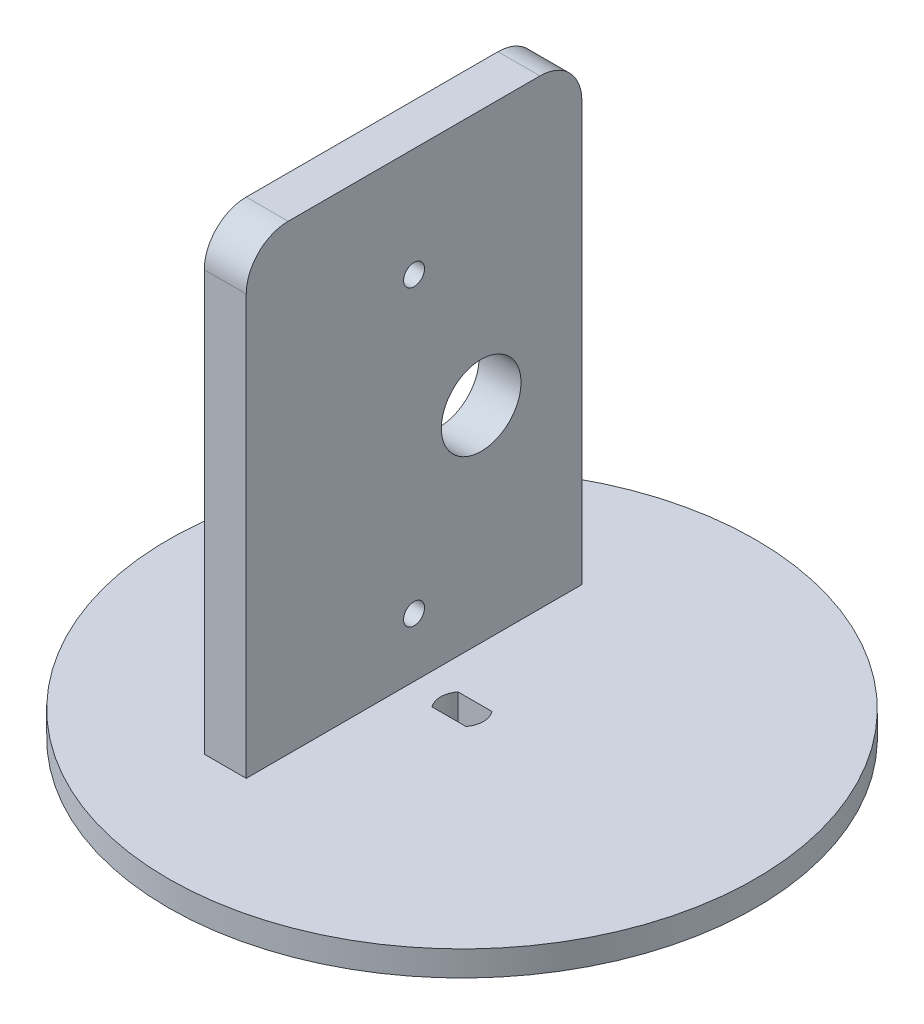
ISO-10303-21;
HEADER;
FILE_DESCRIPTION(('STEP AP214'),'2;1');
FILE_NAME('part.step','',(''),(''),'','','');
FILE_SCHEMA(('AUTOMOTIVE_DESIGN { 1 0 10303 214 1 1 1 1 }'));
ENDSEC;
DATA;
#1=APPLICATION_CONTEXT('core data for automotive mechanical design processes');
#2=APPLICATION_PROTOCOL_DEFINITION('international standard','automotive_design',2000,#1);
#3=PRODUCT_CONTEXT('',#1,'mechanical');
#4=PRODUCT('Part','Part','',(#3));
#5=PRODUCT_RELATED_PRODUCT_CATEGORY('part','',(#4));
#6=PRODUCT_DEFINITION_FORMATION('','',#4);
#7=PRODUCT_DEFINITION_CONTEXT('part definition',#1,'design');
#8=PRODUCT_DEFINITION('design','',#6,#7);
#9=PRODUCT_DEFINITION_SHAPE('','',#8);
#10=(LENGTH_UNIT() NAMED_UNIT(*) SI_UNIT(.MILLI.,.METRE.));
#11=(NAMED_UNIT(*) PLANE_ANGLE_UNIT() SI_UNIT($,.RADIAN.));
#12=(NAMED_UNIT(*) SI_UNIT($,.STERADIAN.) SOLID_ANGLE_UNIT());
#13=UNCERTAINTY_MEASURE_WITH_UNIT(LENGTH_MEASURE(1.E-05),#10,'distance_accuracy_value','');
#14=(GEOMETRIC_REPRESENTATION_CONTEXT(3) GLOBAL_UNCERTAINTY_ASSIGNED_CONTEXT((#13)) GLOBAL_UNIT_ASSIGNED_CONTEXT((#10,
#11,#12)) REPRESENTATION_CONTEXT('',''));
#15=CARTESIAN_POINT('',(0.,0.,0.));
#16=DIRECTION('',(0.,0.,1.));
#17=DIRECTION('',(1.,0.,0.));
#18=AXIS2_PLACEMENT_3D('',#15,#16,#17);
#19=CARTESIAN_POINT('',(0.,0.,0.));
#20=DIRECTION('',(0.,1.,0.));
#21=DIRECTION('',(0.,0.,1.));
#22=AXIS2_PLACEMENT_3D('',#19,#20,#21);
#23=PLANE('',#22);
#24=CARTESIAN_POINT('',(0.,0.,0.));
#25=DIRECTION('',(0.,1.,0.));
#26=DIRECTION('',(0.,0.,1.));
#27=AXIS2_PLACEMENT_3D('',#24,#25,#26);
#28=CIRCLE('',#27,35.);
#29=CARTESIAN_POINT('',(0.,0.,35.));
#30=VERTEX_POINT('',#29);
#31=EDGE_CURVE('E181',#30,#30,#28,.T.);
#32=ORIENTED_EDGE('',*,*,#31,.F.);
#33=EDGE_LOOP('',(#32));
#34=FACE_BOUND('',#33,.T.);
#35=CARTESIAN_POINT('',(0.,0.,0.));
#36=DIRECTION('',(0.,1.,0.));
#37=DIRECTION('',(0.,0.,1.));
#38=AXIS2_PLACEMENT_3D('',#35,#36,#37);
#39=CIRCLE('',#38,7.5);
#40=CARTESIAN_POINT('',(0.,0.,7.5));
#41=VERTEX_POINT('',#40);
#42=EDGE_CURVE('E185',#41,#41,#39,.F.);
#43=ORIENTED_EDGE('',*,*,#42,.F.);
#44=EDGE_LOOP('',(#43));
#45=FACE_BOUND('',#44,.T.);
#46=ADVANCED_FACE('F33',(#34,#45),#23,.F.);
#47=CARTESIAN_POINT('',(0.,3.,0.));
#48=DIRECTION('',(0.,1.,0.));
#49=DIRECTION('',(0.,0.,1.));
#50=AXIS2_PLACEMENT_3D('',#47,#48,#49);
#51=PLANE('',#50);
#52=DIRECTION('',(0.,0.,-1.));
#53=VECTOR('',#52,1.);
#54=CARTESIAN_POINT('',(-5.7150480190524,3.,-20.));
#55=LINE('',#54,#53);
#56=CARTESIAN_POINT('',(-5.7150480190524,3.,20.));
#57=VERTEX_POINT('',#56);
#58=CARTESIAN_POINT('',(-5.7150480190524,3.,-20.));
#59=VERTEX_POINT('',#58);
#60=EDGE_CURVE('E132',#57,#59,#55,.T.);
#61=ORIENTED_EDGE('',*,*,#60,.F.);
#62=DIRECTION('',(1.,0.,0.));
#63=VECTOR('',#62,1.);
#64=CARTESIAN_POINT('',(-5.7150480190524,3.,20.));
#65=LINE('',#64,#63);
#66=CARTESIAN_POINT('',(-10.7150480190524,3.,20.));
#67=VERTEX_POINT('',#66);
#68=EDGE_CURVE('E129',#67,#57,#65,.T.);
#69=ORIENTED_EDGE('',*,*,#68,.F.);
#70=DIRECTION('',(0.,0.,1.));
#71=VECTOR('',#70,1.);
#72=CARTESIAN_POINT('',(-10.7150480190524,3.,-20.));
#73=LINE('',#72,#71);
#74=CARTESIAN_POINT('',(-10.7150480190524,3.,-20.));
#75=VERTEX_POINT('',#74);
#76=EDGE_CURVE('E114',#75,#67,#73,.T.);
#77=ORIENTED_EDGE('',*,*,#76,.F.);
#78=DIRECTION('',(-1.,0.,0.));
#79=VECTOR('',#78,1.);
#80=CARTESIAN_POINT('',(-5.7150480190524,3.,-20.));
#81=LINE('',#80,#79);
#82=EDGE_CURVE('E126',#59,#75,#81,.T.);
#83=ORIENTED_EDGE('',*,*,#82,.F.);
#84=EDGE_LOOP('',(#61,#69,#77,#83));
#85=FACE_BOUND('',#84,.T.);
#86=CARTESIAN_POINT('',(0.,3.,0.));
#87=DIRECTION('',(0.,1.,0.));
#88=DIRECTION('',(0.,0.,1.));
#89=AXIS2_PLACEMENT_3D('',#86,#87,#88);
#90=CIRCLE('',#89,35.);
#91=CARTESIAN_POINT('',(0.,3.,35.));
#92=VERTEX_POINT('',#91);
#93=EDGE_CURVE('E182',#92,#92,#90,.T.);
#94=ORIENTED_EDGE('',*,*,#93,.T.);
#95=EDGE_LOOP('',(#94));
#96=FACE_BOUND('',#95,.T.);
#97=DIRECTION('',(1.,0.,0.));
#98=VECTOR('',#97,1.);
#99=CARTESIAN_POINT('',(-2.02484567313166,3.,1.55));
#100=LINE('',#99,#98);
#101=CARTESIAN_POINT('',(-2.02484567313166,3.,1.55));
#102=VERTEX_POINT('',#101);
#103=CARTESIAN_POINT('',(2.02484567313166,3.,1.55));
#104=VERTEX_POINT('',#103);
#105=EDGE_CURVE('E166',#102,#104,#100,.T.);
#106=ORIENTED_EDGE('',*,*,#105,.F.);
#107=CARTESIAN_POINT('',(0.,3.,0.));
#108=DIRECTION('',(0.,1.,0.));
#109=DIRECTION('',(0.,0.,1.));
#110=AXIS2_PLACEMENT_3D('',#107,#108,#109);
#111=CIRCLE('',#110,2.55);
#112=CARTESIAN_POINT('',(-2.02484567313166,3.,-1.55));
#113=VERTEX_POINT('',#112);
#114=EDGE_CURVE('E164',#113,#102,#111,.T.);
#115=ORIENTED_EDGE('',*,*,#114,.F.);
#116=DIRECTION('',(-1.,0.,0.));
#117=VECTOR('',#116,1.);
#118=CARTESIAN_POINT('',(-2.02484567313166,3.,-1.55));
#119=LINE('',#118,#117);
#120=CARTESIAN_POINT('',(2.02484567313166,3.,-1.55));
#121=VERTEX_POINT('',#120);
#122=EDGE_CURVE('E171',#121,#113,#119,.T.);
#123=ORIENTED_EDGE('',*,*,#122,.F.);
#124=CARTESIAN_POINT('',(0.,3.,0.));
#125=DIRECTION('',(0.,1.,0.));
#126=DIRECTION('',(0.,0.,1.));
#127=AXIS2_PLACEMENT_3D('',#124,#125,#126);
#128=CIRCLE('',#127,2.55);
#129=EDGE_CURVE('E168',#104,#121,#128,.T.);
#130=ORIENTED_EDGE('',*,*,#129,.F.);
#131=EDGE_LOOP('',(#106,#115,#123,#130));
#132=FACE_BOUND('',#131,.T.);
#133=ADVANCED_FACE('F124',(#85,#96,#132),#51,.T.);
#134=CARTESIAN_POINT('',(0.,3.,0.));
#135=DIRECTION('',(0.,-1.,0.));
#136=DIRECTION('',(0.,0.,-1.));
#137=AXIS2_PLACEMENT_3D('',#134,#135,#136);
#138=CYLINDRICAL_SURFACE('',#137,35.);
#139=ORIENTED_EDGE('',*,*,#93,.F.);
#140=EDGE_LOOP('',(#139));
#141=FACE_BOUND('',#140,.T.);
#142=ORIENTED_EDGE('',*,*,#31,.T.);
#143=EDGE_LOOP('',(#142));
#144=FACE_BOUND('',#143,.T.);
#145=ADVANCED_FACE('F229',(#141,#144),#138,.T.);
#146=CARTESIAN_POINT('',(0.,3.,0.));
#147=DIRECTION('',(0.,-1.,0.));
#148=DIRECTION('',(0.,0.,-1.));
#149=AXIS2_PLACEMENT_3D('',#146,#147,#148);
#150=CYLINDRICAL_SURFACE('',#149,2.55);
#151=DIRECTION('',(0.,-1.,0.));
#152=VECTOR('',#151,1.);
#153=CARTESIAN_POINT('',(-2.02484567313166,3.,1.55));
#154=LINE('',#153,#152);
#155=CARTESIAN_POINT('',(-2.02484567313166,-6.,1.55));
#156=VERTEX_POINT('',#155);
#157=EDGE_CURVE('E179',#102,#156,#154,.T.);
#158=ORIENTED_EDGE('',*,*,#157,.T.);
#159=CARTESIAN_POINT('',(0.,-6.,0.));
#160=DIRECTION('',(0.,-1.,0.));
#161=DIRECTION('',(0.,0.,-1.));
#162=AXIS2_PLACEMENT_3D('',#159,#160,#161);
#163=CIRCLE('',#162,2.55);
#164=CARTESIAN_POINT('',(-2.02484567313166,-6.,-1.55));
#165=VERTEX_POINT('',#164);
#166=EDGE_CURVE('E149',#156,#165,#163,.T.);
#167=ORIENTED_EDGE('',*,*,#166,.T.);
#168=DIRECTION('',(0.,-1.,0.));
#169=VECTOR('',#168,1.);
#170=CARTESIAN_POINT('',(-2.02484567313166,3.,-1.55));
#171=LINE('',#170,#169);
#172=EDGE_CURVE('E173',#113,#165,#171,.T.);
#173=ORIENTED_EDGE('',*,*,#172,.F.);
#174=ORIENTED_EDGE('',*,*,#114,.T.);
#175=EDGE_LOOP('',(#158,#167,#173,#174));
#176=FACE_BOUND('',#175,.T.);
#177=ADVANCED_FACE('F236',(#176),#150,.F.);
#178=CARTESIAN_POINT('',(-2.02484567313166,3.,1.55));
#179=DIRECTION('',(0.,0.,-1.));
#180=DIRECTION('',(-1.,0.,0.));
#181=AXIS2_PLACEMENT_3D('',#178,#179,#180);
#182=PLANE('',#181);
#183=CARTESIAN_POINT('',(0.,-3.,1.55));
#184=DIRECTION('',(0.,0.,-1.));
#185=DIRECTION('',(-1.,0.,0.));
#186=AXIS2_PLACEMENT_3D('',#183,#184,#185);
#187=CIRCLE('',#186,1.25);
#188=CARTESIAN_POINT('',(-1.25,-3.,1.55));
#189=VERTEX_POINT('',#188);
#190=EDGE_CURVE('E145',#189,#189,#187,.T.);
#191=ORIENTED_EDGE('',*,*,#190,.F.);
#192=EDGE_LOOP('',(#191));
#193=FACE_BOUND('',#192,.T.);
#194=DIRECTION('',(0.,-1.,0.));
#195=VECTOR('',#194,1.);
#196=CARTESIAN_POINT('',(2.02484567313166,3.,1.55));
#197=LINE('',#196,#195);
#198=CARTESIAN_POINT('',(2.02484567313166,-6.,1.55));
#199=VERTEX_POINT('',#198);
#200=EDGE_CURVE('E177',#104,#199,#197,.T.);
#201=ORIENTED_EDGE('',*,*,#200,.T.);
#202=DIRECTION('',(-1.,0.,0.));
#203=VECTOR('',#202,1.);
#204=CARTESIAN_POINT('',(-2.02484567313166,-6.,1.55));
#205=LINE('',#204,#203);
#206=EDGE_CURVE('E158',#199,#156,#205,.T.);
#207=ORIENTED_EDGE('',*,*,#206,.T.);
#208=ORIENTED_EDGE('',*,*,#157,.F.);
#209=ORIENTED_EDGE('',*,*,#105,.T.);
#210=EDGE_LOOP('',(#201,#207,#208,#209));
#211=FACE_BOUND('',#210,.T.);
#212=ADVANCED_FACE('F337',(#193,#211),#182,.T.);
#213=CARTESIAN_POINT('',(0.,3.,0.));
#214=DIRECTION('',(0.,-1.,0.));
#215=DIRECTION('',(0.,0.,-1.));
#216=AXIS2_PLACEMENT_3D('',#213,#214,#215);
#217=CYLINDRICAL_SURFACE('',#216,2.55);
#218=DIRECTION('',(0.,-1.,0.));
#219=VECTOR('',#218,1.);
#220=CARTESIAN_POINT('',(2.02484567313166,3.,-1.55));
#221=LINE('',#220,#219);
#222=CARTESIAN_POINT('',(2.02484567313166,-6.,-1.55));
#223=VERTEX_POINT('',#222);
#224=EDGE_CURVE('E175',#121,#223,#221,.T.);
#225=ORIENTED_EDGE('',*,*,#224,.T.);
#226=CARTESIAN_POINT('',(0.,-6.,0.));
#227=DIRECTION('',(0.,-1.,0.));
#228=DIRECTION('',(0.,0.,-1.));
#229=AXIS2_PLACEMENT_3D('',#226,#227,#228);
#230=CIRCLE('',#229,2.55);
#231=EDGE_CURVE('E155',#223,#199,#230,.T.);
#232=ORIENTED_EDGE('',*,*,#231,.T.);
#233=ORIENTED_EDGE('',*,*,#200,.F.);
#234=ORIENTED_EDGE('',*,*,#129,.T.);
#235=EDGE_LOOP('',(#225,#232,#233,#234));
#236=FACE_BOUND('',#235,.T.);
#237=ADVANCED_FACE('F219',(#236),#217,.F.);
#238=CARTESIAN_POINT('',(-2.02484567313166,3.,-1.55));
#239=DIRECTION('',(0.,0.,1.));
#240=DIRECTION('',(1.,0.,0.));
#241=AXIS2_PLACEMENT_3D('',#238,#239,#240);
#242=PLANE('',#241);
#243=ORIENTED_EDGE('',*,*,#172,.T.);
#244=DIRECTION('',(1.,0.,0.));
#245=VECTOR('',#244,1.);
#246=CARTESIAN_POINT('',(-2.02484567313166,-6.,-1.55));
#247=LINE('',#246,#245);
#248=EDGE_CURVE('E152',#165,#223,#247,.T.);
#249=ORIENTED_EDGE('',*,*,#248,.T.);
#250=ORIENTED_EDGE('',*,*,#224,.F.);
#251=ORIENTED_EDGE('',*,*,#122,.T.);
#252=EDGE_LOOP('',(#243,#249,#250,#251));
#253=FACE_BOUND('',#252,.T.);
#254=ADVANCED_FACE('F212',(#253),#242,.T.);
#255=CARTESIAN_POINT('',(0.,-6.,0.));
#256=DIRECTION('',(0.,-1.,0.));
#257=DIRECTION('',(0.,0.,-1.));
#258=AXIS2_PLACEMENT_3D('',#255,#256,#257);
#259=PLANE('',#258);
#260=CARTESIAN_POINT('',(0.,-6.,0.));
#261=DIRECTION('',(0.,-1.,0.));
#262=DIRECTION('',(0.,0.,-1.));
#263=AXIS2_PLACEMENT_3D('',#260,#261,#262);
#264=CIRCLE('',#263,7.5);
#265=CARTESIAN_POINT('',(0.,-6.,-7.5));
#266=VERTEX_POINT('',#265);
#267=EDGE_CURVE('E161',#266,#266,#264,.T.);
#268=ORIENTED_EDGE('',*,*,#267,.T.);
#269=EDGE_LOOP('',(#268));
#270=FACE_BOUND('',#269,.T.);
#271=ORIENTED_EDGE('',*,*,#248,.F.);
#272=ORIENTED_EDGE('',*,*,#166,.F.);
#273=ORIENTED_EDGE('',*,*,#206,.F.);
#274=ORIENTED_EDGE('',*,*,#231,.F.);
#275=EDGE_LOOP('',(#271,#272,#273,#274));
#276=FACE_BOUND('',#275,.T.);
#277=ADVANCED_FACE('F210',(#270,#276),#259,.T.);
#278=CARTESIAN_POINT('',(0.,-6.,0.));
#279=DIRECTION('',(0.,1.,0.));
#280=DIRECTION('',(0.,0.,1.));
#281=AXIS2_PLACEMENT_3D('',#278,#279,#280);
#282=CYLINDRICAL_SURFACE('',#281,7.5);
#283=CARTESIAN_POINT('',(0.,-4.25,7.5));
#284=CARTESIAN_POINT('',(-0.0696954524791074,-4.24999720552609,7.49999880584412));
#285=CARTESIAN_POINT('',(-0.13942894091941,-4.24415136251554,7.49901838956517));
#286=CARTESIAN_POINT('',(-0.276940110836521,-4.22093217061734,7.49520172470694));
#287=CARTESIAN_POINT('',(-0.344715933979624,-4.2035482215442,7.49236376961945));
#288=CARTESIAN_POINT('',(-0.476302373606322,-4.15779227570362,7.48515034118225));
#289=CARTESIAN_POINT('',(-0.54011618421595,-4.12942926717971,7.48077612579596));
#290=CARTESIAN_POINT('',(-0.662070920988972,-4.0625438539738,7.47097113541035));
#291=CARTESIAN_POINT('',(-0.720212494939296,-4.0240226112585,7.46554048127217));
#292=CARTESIAN_POINT('',(-0.82973630714584,-3.93752245808977,7.45416658729156));
#293=CARTESIAN_POINT('',(-0.881056451767484,-3.88946544268194,7.44821935907428));
#294=CARTESIAN_POINT('',(-0.974944249329964,-3.78542601576359,7.43651313438366));
#295=CARTESIAN_POINT('',(-1.01751134969549,-3.72944310427169,7.43075414981334));
#296=CARTESIAN_POINT('',(-1.09293356280257,-3.61071451690147,7.4200378287989));
#297=CARTESIAN_POINT('',(-1.1257272764305,-3.54792933159762,7.41508564545818));
#298=CARTESIAN_POINT('',(-1.18027918270561,-3.41764521784969,7.40659894897337));
#299=CARTESIAN_POINT('',(-1.20203812078281,-3.35014660816118,7.40306434007154));
#300=CARTESIAN_POINT('',(-1.2337071888924,-3.21300986257173,7.39785268421378));
#301=CARTESIAN_POINT('',(-1.2437245145677,-3.1433971317493,7.3961588424285));
#302=CARTESIAN_POINT('',(-1.25195836264494,-3.00345986155826,7.39476969468325));
#303=CARTESIAN_POINT('',(-1.2501757201945,-2.93313537291635,7.39507424728607));
#304=CARTESIAN_POINT('',(-1.23494754919808,-2.79453606936228,7.39763214431778));
#305=CARTESIAN_POINT('',(-1.22162244094489,-2.72624759822738,7.39986536659458));
#306=CARTESIAN_POINT('',(-1.18387657020172,-2.59288934108543,7.40599747605504));
#307=CARTESIAN_POINT('',(-1.15945542715987,-2.52781966555573,7.40989642036636));
#308=CARTESIAN_POINT('',(-1.10008862304696,-2.40238558827954,7.4189423966705));
#309=CARTESIAN_POINT('',(-1.06509295693986,-2.34204529695939,7.42409533553663));
#310=CARTESIAN_POINT('',(-0.985606008778717,-2.22804779973081,7.43506459207504));
#311=CARTESIAN_POINT('',(-0.941113960327144,-2.17439113377253,7.44088096327143));
#312=CARTESIAN_POINT('',(-0.843241106079527,-2.07458695709633,7.45261013939893));
#313=CARTESIAN_POINT('',(-0.789756981936563,-2.02854074072996,7.45852324615826));
#314=CARTESIAN_POINT('',(-0.675767624490823,-1.94606111866733,7.46971300698362));
#315=CARTESIAN_POINT('',(-0.615262345953211,-1.90962777490839,7.47498965694873));
#316=CARTESIAN_POINT('',(-0.488852958083356,-1.84739888643186,7.48431946446456));
#317=CARTESIAN_POINT('',(-0.422944362782331,-1.82161229033437,7.48837159203724));
#318=CARTESIAN_POINT('',(-0.287649172801366,-1.78150289237701,7.4947875150633));
#319=CARTESIAN_POINT('',(-0.218262869589734,-1.76717913151314,7.49715145175237));
#320=CARTESIAN_POINT('',(-0.0788549506508121,-1.75053932076943,7.49990564921343));
#321=CARTESIAN_POINT('',(-0.00885036857550596,-1.7480842140972,7.50031876506392));
#322=CARTESIAN_POINT('',(0.130569886444943,-1.75488067221406,7.49918737210585));
#323=CARTESIAN_POINT('',(0.199985581946019,-1.76413178656687,7.49764293862059));
#324=CARTESIAN_POINT('',(0.335828087773382,-1.79396242466774,7.49278413469101));
#325=CARTESIAN_POINT('',(0.402270434192689,-1.81447310419506,7.48948052400655));
#326=CARTESIAN_POINT('',(0.530773442430221,-1.86616725909977,7.48147232227679));
#327=CARTESIAN_POINT('',(0.592833857954859,-1.89735133381764,7.4767676525601));
#328=CARTESIAN_POINT('',(0.711415344734479,-1.96982556234839,7.46642258151204));
#329=CARTESIAN_POINT('',(0.767882625468574,-2.01120257808363,7.46077427943511));
#330=CARTESIAN_POINT('',(0.873121792751344,-2.10276865769253,7.4491923369595));
#331=CARTESIAN_POINT('',(0.921893119848291,-2.15295836163833,7.44325867585773));
#332=CARTESIAN_POINT('',(1.010871389829,-2.26134877403571,7.43170087617923));
#333=CARTESIAN_POINT('',(1.05098438055686,-2.31962708275721,7.42608058068553));
#334=CARTESIAN_POINT('',(1.12085115514749,-2.44217648456927,7.41585764888942));
#335=CARTESIAN_POINT('',(1.15060526738491,-2.50644738761375,7.4112549803301));
#336=CARTESIAN_POINT('',(1.19876916573657,-2.63889486640607,7.40361726848852));
#337=CARTESIAN_POINT('',(1.21722571627397,-2.70705404751524,7.40057577155532));
#338=CARTESIAN_POINT('',(1.24241772688914,-2.84556006461088,7.3963885841763));
#339=CARTESIAN_POINT('',(1.24915420597308,-2.91590670986603,7.39524272891361));
#340=CARTESIAN_POINT('',(1.25068643302368,-3.0558525829812,7.39498366542006));
#341=CARTESIAN_POINT('',(1.24563006806259,-3.12545018928764,7.39584528252825));
#342=CARTESIAN_POINT('',(1.22403991947842,-3.26278962402538,7.39944890726864));
#343=CARTESIAN_POINT('',(1.20750617305624,-3.33053145847094,7.40219090880607));
#344=CARTESIAN_POINT('',(1.16348724479745,-3.46217921864631,7.40923678140859));
#345=CARTESIAN_POINT('',(1.13601479530022,-3.52608950502801,7.41353883609835));
#346=CARTESIAN_POINT('',(1.07091350195795,-3.64841783459742,7.42322184461104));
#347=CARTESIAN_POINT('',(1.03328415437428,-3.70683560518607,7.428602851942));
#348=CARTESIAN_POINT('',(0.948409442186078,-3.81726779155388,7.43991727022811));
#349=CARTESIAN_POINT('',(0.901055281796824,-3.86919800835014,7.44585647788151));
#350=CARTESIAN_POINT('',(0.798304515690115,-3.96442580223747,7.4575718618042));
#351=CARTESIAN_POINT('',(0.742906056456318,-4.00772138431909,7.46334800013273));
#352=CARTESIAN_POINT('',(0.62518458482014,-4.08472413409997,7.4741326482111));
#353=CARTESIAN_POINT('',(0.562816393766409,-4.11836301965648,7.47913558126552));
#354=CARTESIAN_POINT('',(0.43325653468949,-4.17463474230496,7.48775583800888));
#355=CARTESIAN_POINT('',(0.366069747415005,-4.19727854053985,7.49137454088741));
#356=CARTESIAN_POINT('',(0.2488516550227,-4.22600263706333,7.49602895416478));
#357=CARTESIAN_POINT('',(0.199529415149223,-4.23498723480798,7.49751013636679));
#358=CARTESIAN_POINT('',(0.100144655159904,-4.24698686892238,7.4994960799306));
#359=CARTESIAN_POINT('',(0.0500821478042469,-4.25000200806868,7.50000085810321));
#360=CARTESIAN_POINT('',(0.,-4.25,7.5));
#361=B_SPLINE_CURVE_WITH_KNOTS('',3,(#283,#284,#285,#286,#287,#288,#289,#290,#291,#292,#293,
#294,#295,#296,#297,#298,#299,#300,#301,#302,#303,#304,#305,#306,#307,#308,#309,#310,#311,#312,
#313,#314,#315,#316,#317,#318,#319,#320,#321,#322,#323,#324,#325,#326,#327,#328,#329,#330,#331,
#332,#333,#334,#335,#336,#337,#338,#339,#340,#341,#342,#343,#344,#345,#346,#347,#348,#349,#350,
#351,#352,#353,#354,#355,#356,#357,#358,#359,#360),.UNSPECIFIED.,.T.,.F.,(4,2,2,2,2,2,2,2,2,2,2,
2,2,2,2,2,2,2,2,2,2,2,2,2,2,2,2,2,2,2,2,2,2,2,2,2,2,2,4),(0.,0.208903292469255,0.41799877284771,
0.626923433512635,0.835824206337395,1.04651245531166,1.25721400084928,1.4692126041192,
1.68119688438091,1.89123038551712,2.10124902160443,2.30910260880204,2.51696332512691,
2.72582278316279,2.93469910340287,3.14616384955663,3.35762995817924,3.56927344457952,
3.78089922260574,3.99003941745699,4.1991715651793,4.40703903503208,4.61491817913033,
4.82463412813512,5.03436531527142,5.2462691100381,5.45816618687972,5.66918011170886,
5.88017568893309,6.0885395476135,6.29690273094066,6.50502409113111,6.71315577514668,
6.92375692096696,7.13440666939486,7.346511158036,7.55840376065036,7.70852124082009,
7.85863613638484),.UNSPECIFIED.);
#362=CARTESIAN_POINT('',(0.,-4.25,7.5));
#363=VERTEX_POINT('',#362);
#364=EDGE_CURVE('E148',#363,#363,#361,.T.);
#365=ORIENTED_EDGE('',*,*,#364,.T.);
#366=EDGE_LOOP('',(#365));
#367=FACE_BOUND('',#366,.T.);
#368=ORIENTED_EDGE('',*,*,#267,.F.);
#369=EDGE_LOOP('',(#368));
#370=FACE_BOUND('',#369,.T.);
#371=ORIENTED_EDGE('',*,*,#42,.T.);
#372=EDGE_LOOP('',(#371));
#373=FACE_BOUND('',#372,.T.);
#374=ADVANCED_FACE('F199',(#367,#370,#373),#282,.T.);
#375=CARTESIAN_POINT('',(0.,-3.,7.55));
#376=DIRECTION('',(0.,0.,-1.));
#377=DIRECTION('',(-1.,0.,0.));
#378=AXIS2_PLACEMENT_3D('',#375,#376,#377);
#379=CYLINDRICAL_SURFACE('',#378,1.25);
#380=ORIENTED_EDGE('',*,*,#190,.T.);
#381=EDGE_LOOP('',(#380));
#382=FACE_BOUND('',#381,.T.);
#383=ORIENTED_EDGE('',*,*,#364,.F.);
#384=EDGE_LOOP('',(#383));
#385=FACE_BOUND('',#384,.T.);
#386=ADVANCED_FACE('F203',(#382,#385),#379,.F.);
#387=CARTESIAN_POINT('',(-5.7150480190524,58.,-20.));
#388=DIRECTION('',(-1.,0.,0.));
#389=DIRECTION('',(0.,0.,1.));
#390=AXIS2_PLACEMENT_3D('',#387,#388,#389);
#391=PLANE('',#390);
#392=CARTESIAN_POINT('',(-5.7150480190524,45.,0.));
#393=DIRECTION('',(-1.,0.,0.));
#394=DIRECTION('',(0.,0.,1.));
#395=AXIS2_PLACEMENT_3D('',#392,#393,#394);
#396=CIRCLE('',#395,1.25);
#397=CARTESIAN_POINT('',(-5.7150480190524,45.,1.25));
#398=VERTEX_POINT('',#397);
#399=EDGE_CURVE('E134',#398,#398,#396,.F.);
#400=ORIENTED_EDGE('',*,*,#399,.F.);
#401=EDGE_LOOP('',(#400));
#402=FACE_BOUND('',#401,.T.);
#403=CARTESIAN_POINT('',(-5.7150480190524,10.,0.));
#404=DIRECTION('',(-1.,0.,0.));
#405=DIRECTION('',(0.,0.,1.));
#406=AXIS2_PLACEMENT_3D('',#403,#404,#405);
#407=CIRCLE('',#406,1.25);
#408=CARTESIAN_POINT('',(-5.7150480190524,10.,1.25));
#409=VERTEX_POINT('',#408);
#410=EDGE_CURVE('E275',#409,#409,#407,.F.);
#411=ORIENTED_EDGE('',*,*,#410,.F.);
#412=EDGE_LOOP('',(#411));
#413=FACE_BOUND('',#412,.T.);
#414=CARTESIAN_POINT('',(-5.7150480190524,27.5,-8.));
#415=DIRECTION('',(-1.,0.,0.));
#416=DIRECTION('',(0.,0.,1.));
#417=AXIS2_PLACEMENT_3D('',#414,#415,#416);
#418=CIRCLE('',#417,4.75);
#419=CARTESIAN_POINT('',(-5.7150480190524,27.5,-3.25));
#420=VERTEX_POINT('',#419);
#421=EDGE_CURVE('E268',#420,#420,#418,.F.);
#422=ORIENTED_EDGE('',*,*,#421,.F.);
#423=EDGE_LOOP('',(#422));
#424=FACE_BOUND('',#423,.T.);
#425=DIRECTION('',(0.,-1.,0.));
#426=VECTOR('',#425,1.);
#427=CARTESIAN_POINT('',(-5.7150480190524,58.,-20.));
#428=LINE('',#427,#426);
#429=CARTESIAN_POINT('',(-5.7150480190524,53.,-20.));
#430=VERTEX_POINT('',#429);
#431=EDGE_CURVE('E117',#430,#59,#428,.T.);
#432=ORIENTED_EDGE('',*,*,#431,.F.);
#433=CARTESIAN_POINT('',(-5.7150480190524,53.,-15.));
#434=DIRECTION('',(-1.,0.,0.));
#435=DIRECTION('',(0.,0.,1.));
#436=AXIS2_PLACEMENT_3D('',#433,#434,#435);
#437=CIRCLE('',#436,5.);
#438=CARTESIAN_POINT('',(-5.7150480190524,58.,-15.));
#439=VERTEX_POINT('',#438);
#440=EDGE_CURVE('E41',#430,#439,#437,.F.);
#441=ORIENTED_EDGE('',*,*,#440,.T.);
#442=DIRECTION('',(0.,0.,-1.));
#443=VECTOR('',#442,1.);
#444=CARTESIAN_POINT('',(-5.7150480190524,58.,-20.));
#445=LINE('',#444,#443);
#446=CARTESIAN_POINT('',(-5.7150480190524,58.,15.));
#447=VERTEX_POINT('',#446);
#448=EDGE_CURVE('E139',#447,#439,#445,.T.);
#449=ORIENTED_EDGE('',*,*,#448,.F.);
#450=CARTESIAN_POINT('',(-5.7150480190524,53.,15.));
#451=DIRECTION('',(-1.,0.,0.));
#452=DIRECTION('',(0.,0.,1.));
#453=AXIS2_PLACEMENT_3D('',#450,#451,#452);
#454=CIRCLE('',#453,5.);
#455=CARTESIAN_POINT('',(-5.7150480190524,53.,20.));
#456=VERTEX_POINT('',#455);
#457=EDGE_CURVE('E48',#447,#456,#454,.F.);
#458=ORIENTED_EDGE('',*,*,#457,.T.);
#459=DIRECTION('',(0.,-1.,0.));
#460=VECTOR('',#459,1.);
#461=CARTESIAN_POINT('',(-5.7150480190524,58.,20.));
#462=LINE('',#461,#460);
#463=EDGE_CURVE('E140',#456,#57,#462,.T.);
#464=ORIENTED_EDGE('',*,*,#463,.T.);
#465=ORIENTED_EDGE('',*,*,#60,.T.);
#466=EDGE_LOOP('',(#432,#441,#449,#458,#464,#465));
#467=FACE_BOUND('',#466,.T.);
#468=ADVANCED_FACE('F207',(#402,#413,#424,#467),#391,.F.);
#469=CARTESIAN_POINT('',(-5.7150480190524,58.,-20.));
#470=DIRECTION('',(0.,0.,1.));
#471=DIRECTION('',(1.,0.,0.));
#472=AXIS2_PLACEMENT_3D('',#469,#470,#471);
#473=PLANE('',#472);
#474=DIRECTION('',(0.,-1.,0.));
#475=VECTOR('',#474,1.);
#476=CARTESIAN_POINT('',(-10.7150480190524,58.,-20.));
#477=LINE('',#476,#475);
#478=CARTESIAN_POINT('',(-10.7150480190524,53.,-20.));
#479=VERTEX_POINT('',#478);
#480=EDGE_CURVE('E109',#479,#75,#477,.T.);
#481=ORIENTED_EDGE('',*,*,#480,.F.);
#482=DIRECTION('',(-1.,0.,0.));
#483=VECTOR('',#482,1.);
#484=CARTESIAN_POINT('',(-5.7150480190524,53.,-20.));
#485=LINE('',#484,#483);
#486=EDGE_CURVE('E56',#479,#430,#485,.F.);
#487=ORIENTED_EDGE('',*,*,#486,.T.);
#488=ORIENTED_EDGE('',*,*,#431,.T.);
#489=ORIENTED_EDGE('',*,*,#82,.T.);
#490=EDGE_LOOP('',(#481,#487,#488,#489));
#491=FACE_BOUND('',#490,.T.);
#492=ADVANCED_FACE('F131',(#491),#473,.F.);
#493=CARTESIAN_POINT('',(-10.7150480190524,58.,-20.));
#494=DIRECTION('',(1.,0.,0.));
#495=DIRECTION('',(0.,0.,-1.));
#496=AXIS2_PLACEMENT_3D('',#493,#494,#495);
#497=PLANE('',#496);
#498=CARTESIAN_POINT('',(-10.7150480190524,45.,0.));
#499=DIRECTION('',(-1.,0.,0.));
#500=DIRECTION('',(0.,0.,1.));
#501=AXIS2_PLACEMENT_3D('',#498,#499,#500);
#502=CIRCLE('',#501,1.25);
#503=CARTESIAN_POINT('',(-10.7150480190524,45.,1.25));
#504=VERTEX_POINT('',#503);
#505=EDGE_CURVE('E278',#504,#504,#502,.T.);
#506=ORIENTED_EDGE('',*,*,#505,.F.);
#507=EDGE_LOOP('',(#506));
#508=FACE_BOUND('',#507,.T.);
#509=CARTESIAN_POINT('',(-10.7150480190524,10.,0.));
#510=DIRECTION('',(-1.,0.,0.));
#511=DIRECTION('',(0.,0.,1.));
#512=AXIS2_PLACEMENT_3D('',#509,#510,#511);
#513=CIRCLE('',#512,1.25);
#514=CARTESIAN_POINT('',(-10.7150480190524,10.,1.25));
#515=VERTEX_POINT('',#514);
#516=EDGE_CURVE('E271',#515,#515,#513,.T.);
#517=ORIENTED_EDGE('',*,*,#516,.F.);
#518=EDGE_LOOP('',(#517));
#519=FACE_BOUND('',#518,.T.);
#520=CARTESIAN_POINT('',(-10.7150480190524,27.5,-8.));
#521=DIRECTION('',(-1.,0.,0.));
#522=DIRECTION('',(0.,0.,1.));
#523=AXIS2_PLACEMENT_3D('',#520,#521,#522);
#524=CIRCLE('',#523,4.75);
#525=CARTESIAN_POINT('',(-10.7150480190524,27.5,-3.25));
#526=VERTEX_POINT('',#525);
#527=EDGE_CURVE('E272',#526,#526,#524,.T.);
#528=ORIENTED_EDGE('',*,*,#527,.F.);
#529=EDGE_LOOP('',(#528));
#530=FACE_BOUND('',#529,.T.);
#531=DIRECTION('',(0.,0.,1.));
#532=VECTOR('',#531,1.);
#533=CARTESIAN_POINT('',(-10.7150480190524,58.,-20.));
#534=LINE('',#533,#532);
#535=CARTESIAN_POINT('',(-10.7150480190524,58.,-15.));
#536=VERTEX_POINT('',#535);
#537=CARTESIAN_POINT('',(-10.7150480190524,58.,15.));
#538=VERTEX_POINT('',#537);
#539=EDGE_CURVE('E142',#536,#538,#534,.T.);
#540=ORIENTED_EDGE('',*,*,#539,.F.);
#541=CARTESIAN_POINT('',(-10.7150480190524,53.,-15.));
#542=DIRECTION('',(1.,0.,0.));
#543=DIRECTION('',(0.,0.,-1.));
#544=AXIS2_PLACEMENT_3D('',#541,#542,#543);
#545=CIRCLE('',#544,5.);
#546=EDGE_CURVE('E115',#536,#479,#545,.F.);
#547=ORIENTED_EDGE('',*,*,#546,.T.);
#548=ORIENTED_EDGE('',*,*,#480,.T.);
#549=ORIENTED_EDGE('',*,*,#76,.T.);
#550=DIRECTION('',(0.,-1.,0.));
#551=VECTOR('',#550,1.);
#552=CARTESIAN_POINT('',(-10.7150480190524,58.,20.));
#553=LINE('',#552,#551);
#554=CARTESIAN_POINT('',(-10.7150480190524,53.,20.));
#555=VERTEX_POINT('',#554);
#556=EDGE_CURVE('E118',#555,#67,#553,.T.);
#557=ORIENTED_EDGE('',*,*,#556,.F.);
#558=CARTESIAN_POINT('',(-10.7150480190524,53.,15.));
#559=DIRECTION('',(1.,0.,0.));
#560=DIRECTION('',(0.,0.,-1.));
#561=AXIS2_PLACEMENT_3D('',#558,#559,#560);
#562=CIRCLE('',#561,5.);
#563=EDGE_CURVE('E259',#555,#538,#562,.F.);
#564=ORIENTED_EDGE('',*,*,#563,.T.);
#565=EDGE_LOOP('',(#540,#547,#548,#549,#557,#564));
#566=FACE_BOUND('',#565,.T.);
#567=ADVANCED_FACE('F112',(#508,#519,#530,#566),#497,.F.);
#568=CARTESIAN_POINT('',(-5.7150480190524,58.,20.));
#569=DIRECTION('',(0.,0.,-1.));
#570=DIRECTION('',(-1.,0.,0.));
#571=AXIS2_PLACEMENT_3D('',#568,#569,#570);
#572=PLANE('',#571);
#573=ORIENTED_EDGE('',*,*,#463,.F.);
#574=DIRECTION('',(1.,0.,0.));
#575=VECTOR('',#574,1.);
#576=CARTESIAN_POINT('',(-5.7150480190524,53.,20.));
#577=LINE('',#576,#575);
#578=EDGE_CURVE('E11',#456,#555,#577,.F.);
#579=ORIENTED_EDGE('',*,*,#578,.T.);
#580=ORIENTED_EDGE('',*,*,#556,.T.);
#581=ORIENTED_EDGE('',*,*,#68,.T.);
#582=EDGE_LOOP('',(#573,#579,#580,#581));
#583=FACE_BOUND('',#582,.T.);
#584=ADVANCED_FACE('F289',(#583),#572,.F.);
#585=CARTESIAN_POINT('',(0.,58.,0.));
#586=DIRECTION('',(0.,-1.,0.));
#587=DIRECTION('',(0.,0.,-1.));
#588=AXIS2_PLACEMENT_3D('',#585,#586,#587);
#589=PLANE('',#588);
#590=ORIENTED_EDGE('',*,*,#448,.T.);
#591=DIRECTION('',(-1.,0.,0.));
#592=VECTOR('',#591,1.);
#593=CARTESIAN_POINT('',(0.,58.,-15.));
#594=LINE('',#593,#592);
#595=EDGE_CURVE('E253',#439,#536,#594,.T.);
#596=ORIENTED_EDGE('',*,*,#595,.T.);
#597=ORIENTED_EDGE('',*,*,#539,.T.);
#598=DIRECTION('',(1.,0.,0.));
#599=VECTOR('',#598,1.);
#600=CARTESIAN_POINT('',(0.,58.,15.));
#601=LINE('',#600,#599);
#602=EDGE_CURVE('E190',#538,#447,#601,.T.);
#603=ORIENTED_EDGE('',*,*,#602,.T.);
#604=EDGE_LOOP('',(#590,#596,#597,#603));
#605=FACE_BOUND('',#604,.T.);
#606=ADVANCED_FACE('F264',(#605),#589,.F.);
#607=CARTESIAN_POINT('',(7.719980823492,27.5,-8.));
#608=DIRECTION('',(-1.,0.,0.));
#609=DIRECTION('',(0.,0.,1.));
#610=AXIS2_PLACEMENT_3D('',#607,#608,#609);
#611=CYLINDRICAL_SURFACE('',#610,4.75);
#612=ORIENTED_EDGE('',*,*,#421,.T.);
#613=EDGE_LOOP('',(#612));
#614=FACE_BOUND('',#613,.T.);
#615=ORIENTED_EDGE('',*,*,#527,.T.);
#616=EDGE_LOOP('',(#615));
#617=FACE_BOUND('',#616,.T.);
#618=ADVANCED_FACE('F295',(#614,#617),#611,.F.);
#619=CARTESIAN_POINT('',(7.719980823492,10.,0.));
#620=DIRECTION('',(-1.,0.,0.));
#621=DIRECTION('',(0.,0.,1.));
#622=AXIS2_PLACEMENT_3D('',#619,#620,#621);
#623=CYLINDRICAL_SURFACE('',#622,1.25);
#624=ORIENTED_EDGE('',*,*,#410,.T.);
#625=EDGE_LOOP('',(#624));
#626=FACE_BOUND('',#625,.T.);
#627=ORIENTED_EDGE('',*,*,#516,.T.);
#628=EDGE_LOOP('',(#627));
#629=FACE_BOUND('',#628,.T.);
#630=ADVANCED_FACE('F247',(#626,#629),#623,.F.);
#631=CARTESIAN_POINT('',(7.719980823492,45.,0.));
#632=DIRECTION('',(-1.,0.,0.));
#633=DIRECTION('',(0.,0.,1.));
#634=AXIS2_PLACEMENT_3D('',#631,#632,#633);
#635=CYLINDRICAL_SURFACE('',#634,1.25);
#636=ORIENTED_EDGE('',*,*,#399,.T.);
#637=EDGE_LOOP('',(#636));
#638=FACE_BOUND('',#637,.T.);
#639=ORIENTED_EDGE('',*,*,#505,.T.);
#640=EDGE_LOOP('',(#639));
#641=FACE_BOUND('',#640,.T.);
#642=ADVANCED_FACE('F240',(#638,#641),#635,.F.);
#643=CARTESIAN_POINT('',(0.,53.,-15.));
#644=DIRECTION('',(-1.,0.,0.));
#645=DIRECTION('',(0.,0.,1.));
#646=AXIS2_PLACEMENT_3D('',#643,#644,#645);
#647=CYLINDRICAL_SURFACE('',#646,5.);
#648=ORIENTED_EDGE('',*,*,#440,.F.);
#649=ORIENTED_EDGE('',*,*,#486,.F.);
#650=ORIENTED_EDGE('',*,*,#546,.F.);
#651=ORIENTED_EDGE('',*,*,#595,.F.);
#652=EDGE_LOOP('',(#648,#649,#650,#651));
#653=FACE_BOUND('',#652,.T.);
#654=ADVANCED_FACE('F238',(#653),#647,.T.);
#655=CARTESIAN_POINT('',(0.,53.,15.));
#656=DIRECTION('',(1.,0.,0.));
#657=DIRECTION('',(0.,0.,-1.));
#658=AXIS2_PLACEMENT_3D('',#655,#656,#657);
#659=CYLINDRICAL_SURFACE('',#658,5.);
#660=ORIENTED_EDGE('',*,*,#563,.F.);
#661=ORIENTED_EDGE('',*,*,#578,.F.);
#662=ORIENTED_EDGE('',*,*,#457,.F.);
#663=ORIENTED_EDGE('',*,*,#602,.F.);
#664=EDGE_LOOP('',(#660,#661,#662,#663));
#665=FACE_BOUND('',#664,.T.);
#666=ADVANCED_FACE('F35',(#665),#659,.T.);
#667=CLOSED_SHELL('',(#46,#133,#145,#177,#212,#237,#254,#277,#374,#386,#468,#492,#567,#584,#606,
#618,#630,#642,#654,#666));
#668=MANIFOLD_SOLID_BREP('B2',#667);
#669=ADVANCED_BREP_SHAPE_REPRESENTATION('',(#18,#668),#14);
#670=SHAPE_DEFINITION_REPRESENTATION(#9,#669);
ENDSEC;
END-ISO-10303-21;
